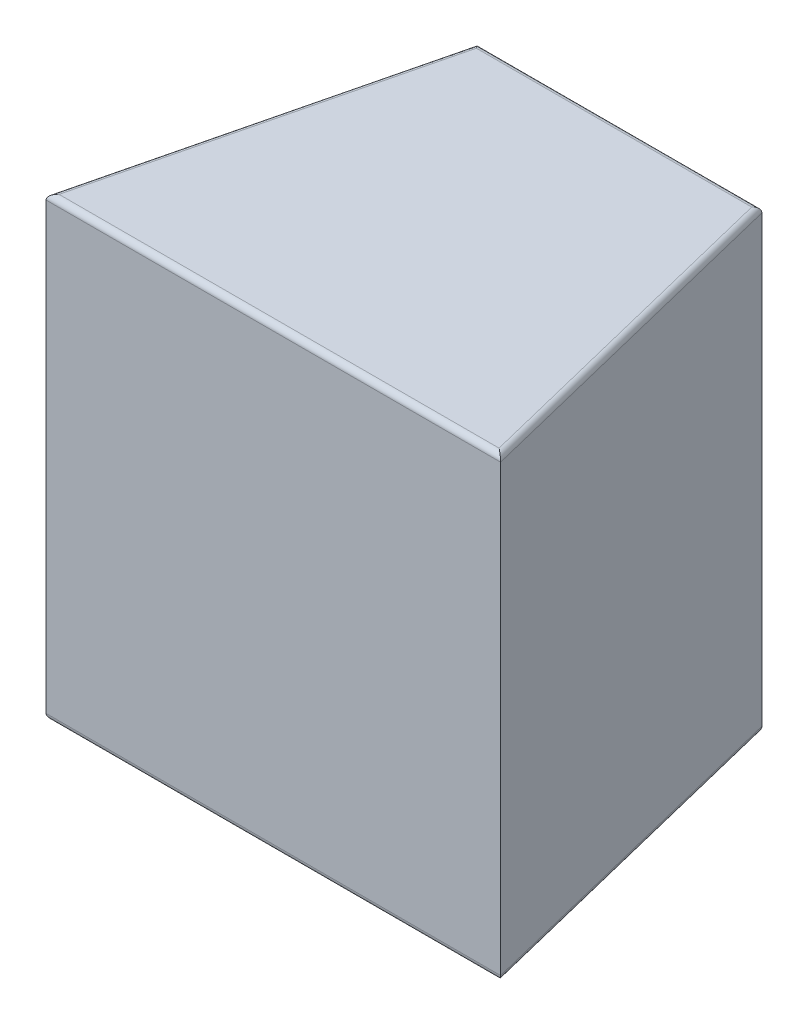
ISO-10303-21;
HEADER;
FILE_DESCRIPTION(('STEP AP214'),'2;1');
FILE_NAME('part.step','',(''),(''),'','','');
FILE_SCHEMA(('AUTOMOTIVE_DESIGN { 1 0 10303 214 1 1 1 1 }'));
ENDSEC;
DATA;
#1=APPLICATION_CONTEXT('core data for automotive mechanical design processes');
#2=APPLICATION_PROTOCOL_DEFINITION('international standard','automotive_design',2000,#1);
#3=PRODUCT_CONTEXT('',#1,'mechanical');
#4=PRODUCT('Part','Part','',(#3));
#5=PRODUCT_RELATED_PRODUCT_CATEGORY('part','',(#4));
#6=PRODUCT_DEFINITION_FORMATION('','',#4);
#7=PRODUCT_DEFINITION_CONTEXT('part definition',#1,'design');
#8=PRODUCT_DEFINITION('design','',#6,#7);
#9=PRODUCT_DEFINITION_SHAPE('','',#8);
#10=(LENGTH_UNIT() NAMED_UNIT(*) SI_UNIT(.MILLI.,.METRE.));
#11=(NAMED_UNIT(*) PLANE_ANGLE_UNIT() SI_UNIT($,.RADIAN.));
#12=(NAMED_UNIT(*) SI_UNIT($,.STERADIAN.) SOLID_ANGLE_UNIT());
#13=UNCERTAINTY_MEASURE_WITH_UNIT(LENGTH_MEASURE(1.E-05),#10,'distance_accuracy_value','');
#14=(GEOMETRIC_REPRESENTATION_CONTEXT(3) GLOBAL_UNCERTAINTY_ASSIGNED_CONTEXT((#13)) GLOBAL_UNIT_ASSIGNED_CONTEXT((#10,
#11,#12)) REPRESENTATION_CONTEXT('',''));
#15=CARTESIAN_POINT('',(0.,0.,0.));
#16=DIRECTION('',(0.,0.,1.));
#17=DIRECTION('',(1.,0.,0.));
#18=AXIS2_PLACEMENT_3D('',#15,#16,#17);
#19=CARTESIAN_POINT('',(12.4540593175391,40.,-15.1130124332802));
#20=DIRECTION('',(-0.971061095311276,0.,0.238831214820981));
#21=DIRECTION('',(0.238831214820981,0.,0.971061095311276));
#22=AXIS2_PLACEMENT_3D('',#19,#20,#21);
#23=PLANE('',#22);
#24=DIRECTION('',(0.,-1.,0.));
#25=VECTOR('',#24,1.);
#26=CARTESIAN_POINT('',(19.9298980943877,40.,15.2829146504495));
#27=LINE('',#26,#25);
#28=CARTESIAN_POINT('',(19.9298980943877,39.5,15.2829146504495));
#29=VERTEX_POINT('',#28);
#30=CARTESIAN_POINT('',(19.9298980943877,0.5,15.2829146504495));
#31=VERTEX_POINT('',#30);
#32=EDGE_CURVE('E163',#29,#31,#27,.T.);
#33=ORIENTED_EDGE('',*,*,#32,.T.);
#34=DIRECTION('',(-0.238831214820981,0.,-0.971061095311276));
#35=VECTOR('',#34,1.);
#36=CARTESIAN_POINT('',(12.4540593175391,0.5,-15.1130124332802));
#37=LINE('',#36,#35);
#38=CARTESIAN_POINT('',(12.4540593175391,0.5,-15.1130124332802));
#39=VERTEX_POINT('',#38);
#40=EDGE_CURVE('E130',#31,#39,#37,.T.);
#41=ORIENTED_EDGE('',*,*,#40,.T.);
#42=DIRECTION('',(0.,-1.,0.));
#43=VECTOR('',#42,1.);
#44=CARTESIAN_POINT('',(12.4540593175391,40.,-15.1130124332802));
#45=LINE('',#44,#43);
#46=CARTESIAN_POINT('',(12.4540593175391,39.5,-15.1130124332802));
#47=VERTEX_POINT('',#46);
#48=EDGE_CURVE('E114',#47,#39,#45,.T.);
#49=ORIENTED_EDGE('',*,*,#48,.F.);
#50=DIRECTION('',(-0.238831214820981,0.,-0.971061095311276));
#51=VECTOR('',#50,1.);
#52=CARTESIAN_POINT('',(12.4540593175391,39.5,-15.1130124332802));
#53=LINE('',#52,#51);
#54=EDGE_CURVE('E127',#47,#29,#53,.F.);
#55=ORIENTED_EDGE('',*,*,#54,.T.);
#56=EDGE_LOOP('',(#33,#41,#49,#55));
#57=FACE_BOUND('',#56,.T.);
#58=ADVANCED_FACE('F43',(#57),#23,.F.);
#59=CARTESIAN_POINT('',(-12.4773510107308,40.,-15.0994144570133));
#60=DIRECTION('',(0.000545415364206491,0.,0.999999851261029));
#61=DIRECTION('',(0.999999851261029,0.,-0.000545415364206491));
#62=AXIS2_PLACEMENT_3D('',#59,#60,#61);
#63=PLANE('',#62);
#64=ORIENTED_EDGE('',*,*,#48,.T.);
#65=DIRECTION('',(-0.999999851261029,0.,0.000545415364206491));
#66=VECTOR('',#65,1.);
#67=CARTESIAN_POINT('',(-12.4773510107308,0.5,-15.0994144570133));
#68=LINE('',#67,#66);
#69=CARTESIAN_POINT('',(-12.4773510107308,0.5,-15.0994144570133));
#70=VERTEX_POINT('',#69);
#71=EDGE_CURVE('E120',#39,#70,#68,.T.);
#72=ORIENTED_EDGE('',*,*,#71,.T.);
#73=DIRECTION('',(0.,-1.,0.));
#74=VECTOR('',#73,1.);
#75=CARTESIAN_POINT('',(-12.4773510107308,40.,-15.0994144570133));
#76=LINE('',#75,#74);
#77=CARTESIAN_POINT('',(-12.4773510107308,39.5,-15.0994144570133));
#78=VERTEX_POINT('',#77);
#79=EDGE_CURVE('E116',#78,#70,#76,.T.);
#80=ORIENTED_EDGE('',*,*,#79,.F.);
#81=DIRECTION('',(-0.999999851261029,0.,0.000545415364206491));
#82=VECTOR('',#81,1.);
#83=CARTESIAN_POINT('',(-12.4773510107308,39.5,-15.0994144570133));
#84=LINE('',#83,#82);
#85=EDGE_CURVE('E111',#78,#47,#84,.F.);
#86=ORIENTED_EDGE('',*,*,#85,.T.);
#87=EDGE_LOOP('',(#64,#72,#80,#86));
#88=FACE_BOUND('',#87,.T.);
#89=ADVANCED_FACE('F113',(#88),#63,.F.);
#90=CARTESIAN_POINT('',(-19.9200285334357,40.,15.3046494159276));
#91=DIRECTION('',(0.971321041962088,0.,0.237771809602576));
#92=DIRECTION('',(0.237771809602576,0.,-0.971321041962088));
#93=AXIS2_PLACEMENT_3D('',#90,#91,#92);
#94=PLANE('',#93);
#95=ORIENTED_EDGE('',*,*,#79,.T.);
#96=DIRECTION('',(-0.237771809602576,0.,0.971321041962088));
#97=VECTOR('',#96,1.);
#98=CARTESIAN_POINT('',(-19.9200285334357,0.5,15.3046494159276));
#99=LINE('',#98,#97);
#100=CARTESIAN_POINT('',(-19.9200285334357,0.5,15.3046494159276));
#101=VERTEX_POINT('',#100);
#102=EDGE_CURVE('E187',#70,#101,#99,.T.);
#103=ORIENTED_EDGE('',*,*,#102,.T.);
#104=DIRECTION('',(0.,-1.,0.));
#105=VECTOR('',#104,1.);
#106=CARTESIAN_POINT('',(-19.9200285334357,40.,15.3046494159276));
#107=LINE('',#106,#105);
#108=CARTESIAN_POINT('',(-19.9200285334357,39.5,15.3046494159276));
#109=VERTEX_POINT('',#108);
#110=EDGE_CURVE('E168',#109,#101,#107,.T.);
#111=ORIENTED_EDGE('',*,*,#110,.F.);
#112=DIRECTION('',(-0.237771809602576,0.,0.971321041962088));
#113=VECTOR('',#112,1.);
#114=CARTESIAN_POINT('',(-19.9200285334357,39.5,15.3046494159276));
#115=LINE('',#114,#113);
#116=EDGE_CURVE('E185',#109,#78,#115,.F.);
#117=ORIENTED_EDGE('',*,*,#116,.T.);
#118=EDGE_LOOP('',(#95,#103,#111,#117));
#119=FACE_BOUND('',#118,.T.);
#120=ADVANCED_FACE('F204',(#119),#94,.F.);
#121=CARTESIAN_POINT('',(19.9298980943877,40.,15.2829146504495));
#122=DIRECTION('',(-0.000545415364206613,0.,-0.999999851261029));
#123=DIRECTION('',(-0.999999851261029,0.,0.000545415364206613));
#124=AXIS2_PLACEMENT_3D('',#121,#122,#123);
#125=PLANE('',#124);
#126=ORIENTED_EDGE('',*,*,#110,.T.);
#127=DIRECTION('',(0.999999851261029,0.,-0.000545415364206613));
#128=VECTOR('',#127,1.);
#129=CARTESIAN_POINT('',(19.9298980943877,0.5,15.2829146504495));
#130=LINE('',#129,#128);
#131=EDGE_CURVE('E191',#101,#31,#130,.T.);
#132=ORIENTED_EDGE('',*,*,#131,.T.);
#133=ORIENTED_EDGE('',*,*,#32,.F.);
#134=DIRECTION('',(0.999999851261029,0.,-0.000545415364206613));
#135=VECTOR('',#134,1.);
#136=CARTESIAN_POINT('',(19.9298980943877,39.5,15.2829146504495));
#137=LINE('',#136,#135);
#138=EDGE_CURVE('E189',#29,#109,#137,.F.);
#139=ORIENTED_EDGE('',*,*,#138,.T.);
#140=EDGE_LOOP('',(#126,#132,#133,#139));
#141=FACE_BOUND('',#140,.T.);
#142=ADVANCED_FACE('F202',(#141),#125,.F.);
#143=CARTESIAN_POINT('',(0.,40.,0.));
#144=DIRECTION('',(0.,-1.,0.));
#145=DIRECTION('',(0.,0.,-1.));
#146=AXIS2_PLACEMENT_3D('',#143,#144,#145);
#147=PLANE('',#146);
#148=DIRECTION('',(0.999999851261029,0.,-0.000545415364206613));
#149=VECTOR('',#148,1.);
#150=CARTESIAN_POINT('',(0.00806875624291231,40.,14.7937802495003));
#151=LINE('',#150,#149);
#152=CARTESIAN_POINT('',(-19.2827844747067,40.,14.8043017788061));
#153=VERTEX_POINT('',#152);
#154=CARTESIAN_POINT('',(19.2921086202945,40.,14.7832624363101));
#155=VERTEX_POINT('',#154);
#156=EDGE_CURVE('E193',#153,#155,#151,.T.);
#157=ORIENTED_EDGE('',*,*,#156,.T.);
#158=DIRECTION('',(-0.238831214820981,0.,-0.971061095311276));
#159=VECTOR('',#158,1.);
#160=CARTESIAN_POINT('',(14.7631502034125,40.,-3.63097761272721));
#161=LINE('',#160,#159);
#162=CARTESIAN_POINT('',(12.0621855926844,40.,-14.6127986249285));
#163=VERTEX_POINT('',#162);
#164=EDGE_CURVE('E11',#155,#163,#161,.T.);
#165=ORIENTED_EDGE('',*,*,#164,.T.);
#166=DIRECTION('',(-0.999999851261029,0.,0.000545415364206491));
#167=VECTOR('',#166,1.);
#168=CARTESIAN_POINT('',(-0.00796645546476035,40.,-14.606215377574));
#169=LINE('',#168,#167);
#170=CARTESIAN_POINT('',(-12.0849318705119,40.,-14.5996284141039));
#171=VERTEX_POINT('',#170);
#172=EDGE_CURVE('E52',#163,#171,#169,.T.);
#173=ORIENTED_EDGE('',*,*,#172,.T.);
#174=DIRECTION('',(-0.237771809602576,0.,0.971321041962088));
#175=VECTOR('',#174,1.);
#176=CARTESIAN_POINT('',(-14.7735295133551,40.,-3.61644471277152));
#177=LINE('',#176,#175);
#178=EDGE_CURVE('E195',#171,#153,#177,.T.);
#179=ORIENTED_EDGE('',*,*,#178,.T.);
#180=EDGE_LOOP('',(#157,#165,#173,#179));
#181=FACE_BOUND('',#180,.T.);
#182=ADVANCED_FACE('F196',(#181),#147,.F.);
#183=CARTESIAN_POINT('',(0.,0.,0.));
#184=DIRECTION('',(0.,-1.,0.));
#185=DIRECTION('',(0.,0.,-1.));
#186=AXIS2_PLACEMENT_3D('',#183,#184,#185);
#187=PLANE('',#186);
#188=DIRECTION('',(-0.999999851261029,0.,0.000545415364206491));
#189=VECTOR('',#188,1.);
#190=CARTESIAN_POINT('',(12.4543320252212,0.,-14.6130125076497));
#191=LINE('',#190,#189);
#192=CARTESIAN_POINT('',(-12.0849318705119,0.,-14.5996284141039));
#193=VERTEX_POINT('',#192);
#194=CARTESIAN_POINT('',(12.0621855926844,0.,-14.6127986249285));
#195=VERTEX_POINT('',#194);
#196=EDGE_CURVE('E180',#193,#195,#191,.F.);
#197=ORIENTED_EDGE('',*,*,#196,.T.);
#198=DIRECTION('',(-0.238831214820981,0.,-0.971061095311276));
#199=VECTOR('',#198,1.);
#200=CARTESIAN_POINT('',(19.4443675467321,0.,15.40233025786));
#201=LINE('',#200,#199);
#202=CARTESIAN_POINT('',(19.2921086202945,0.,14.7832624363101));
#203=VERTEX_POINT('',#202);
#204=EDGE_CURVE('E121',#195,#203,#201,.F.);
#205=ORIENTED_EDGE('',*,*,#204,.T.);
#206=DIRECTION('',(0.999999851261029,0.,-0.000545415364206613));
#207=VECTOR('',#206,1.);
#208=CARTESIAN_POINT('',(-19.9203012411178,0.,14.8046494902971));
#209=LINE('',#208,#207);
#210=CARTESIAN_POINT('',(-19.2827844747067,0.,14.8043017788061));
#211=VERTEX_POINT('',#210);
#212=EDGE_CURVE('E176',#203,#211,#209,.F.);
#213=ORIENTED_EDGE('',*,*,#212,.T.);
#214=DIRECTION('',(-0.237771809602576,0.,0.971321041962088));
#215=VECTOR('',#214,1.);
#216=CARTESIAN_POINT('',(-11.9916904897498,0.,-14.980528552212));
#217=LINE('',#216,#215);
#218=EDGE_CURVE('E178',#211,#193,#217,.F.);
#219=ORIENTED_EDGE('',*,*,#218,.T.);
#220=EDGE_LOOP('',(#197,#205,#213,#219));
#221=FACE_BOUND('',#220,.T.);
#222=ADVANCED_FACE('F230',(#221),#187,.T.);
#223=CARTESIAN_POINT('',(-19.4343680124546,0.5,15.4235353207289));
#224=DIRECTION('',(0.237771809602576,0.,-0.971321041962088));
#225=DIRECTION('',(-0.971321041962088,0.,-0.237771809602576));
#226=AXIS2_PLACEMENT_3D('',#223,#224,#225);
#227=CYLINDRICAL_SURFACE('',#226,0.5);
#228=CARTESIAN_POINT('',(-12.0849318705119,0.5,-14.5996284141039));
#229=DIRECTION('',(0.786524634330285,0.,-0.617558903742477));
#230=DIRECTION('',(-0.617558903742477,0.,-0.786524634330286));
#231=AXIS2_PLACEMENT_3D('',#228,#229,#230);
#232=ELLIPSE('',#231,0.635435968683852,0.5);
#233=EDGE_CURVE('E155',#193,#70,#232,.T.);
#234=ORIENTED_EDGE('',*,*,#233,.F.);
#235=ORIENTED_EDGE('',*,*,#218,.F.);
#236=CARTESIAN_POINT('',(-19.2827844747067,0.5,14.8043017788061));
#237=DIRECTION('',(-0.617558903742477,0.,-0.786524634330286));
#238=DIRECTION('',(-0.786524634330285,0.,0.617558903742477));
#239=AXIS2_PLACEMENT_3D('',#236,#237,#238);
#240=ELLIPSE('',#239,0.810202288541885,0.5);
#241=EDGE_CURVE('E142',#101,#211,#240,.F.);
#242=ORIENTED_EDGE('',*,*,#241,.F.);
#243=ORIENTED_EDGE('',*,*,#102,.F.);
#244=EDGE_LOOP('',(#234,#235,#242,#243));
#245=FACE_BOUND('',#244,.T.);
#246=ADVANCED_FACE('F207',(#245),#227,.T.);
#247=CARTESIAN_POINT('',(19.9296253867056,0.5,14.782914724819));
#248=DIRECTION('',(-0.999999851261029,0.,0.000545415364206613));
#249=DIRECTION('',(0.000545415364206613,0.,0.999999851261029));
#250=AXIS2_PLACEMENT_3D('',#247,#248,#249);
#251=CYLINDRICAL_SURFACE('',#250,0.5);
#252=ORIENTED_EDGE('',*,*,#241,.T.);
#253=ORIENTED_EDGE('',*,*,#212,.F.);
#254=CARTESIAN_POINT('',(19.2921086202945,0.5,14.7832624363101));
#255=DIRECTION('',(-0.616700571210033,0.,0.787197818511471));
#256=DIRECTION('',(-0.787197818511471,0.,-0.616700571210033));
#257=AXIS2_PLACEMENT_3D('',#254,#255,#256);
#258=ELLIPSE('',#257,0.810202288541885,0.5);
#259=EDGE_CURVE('E149',#31,#203,#258,.F.);
#260=ORIENTED_EDGE('',*,*,#259,.F.);
#261=ORIENTED_EDGE('',*,*,#131,.F.);
#262=EDGE_LOOP('',(#252,#253,#260,#261));
#263=FACE_BOUND('',#262,.T.);
#264=ADVANCED_FACE('F209',(#263),#251,.T.);
#265=CARTESIAN_POINT('',(-12.4770783030487,0.5,-14.5994145313827));
#266=DIRECTION('',(0.999999851261029,0.,-0.000545415364206491));
#267=DIRECTION('',(-0.000545415364206491,0.,-0.999999851261029));
#268=AXIS2_PLACEMENT_3D('',#265,#266,#267);
#269=CYLINDRICAL_SURFACE('',#268,0.5);
#270=ORIENTED_EDGE('',*,*,#233,.T.);
#271=ORIENTED_EDGE('',*,*,#71,.F.);
#272=CARTESIAN_POINT('',(12.0621855926844,0.5,-14.6127986249285));
#273=DIRECTION('',(0.787197818511471,0.,0.616700571210033));
#274=DIRECTION('',(0.616700571210033,0.,-0.787197818511471));
#275=AXIS2_PLACEMENT_3D('',#272,#273,#274);
#276=ELLIPSE('',#275,0.635435968683852,0.5);
#277=EDGE_CURVE('E145',#195,#39,#276,.T.);
#278=ORIENTED_EDGE('',*,*,#277,.F.);
#279=ORIENTED_EDGE('',*,*,#196,.F.);
#280=EDGE_LOOP('',(#270,#271,#278,#279));
#281=FACE_BOUND('',#280,.T.);
#282=ADVANCED_FACE('F212',(#281),#269,.T.);
#283=CARTESIAN_POINT('',(11.9685287698835,0.5,-14.9935968258697));
#284=DIRECTION('',(0.238831214820981,0.,0.971061095311276));
#285=DIRECTION('',(0.971061095311276,0.,-0.238831214820981));
#286=AXIS2_PLACEMENT_3D('',#283,#284,#285);
#287=CYLINDRICAL_SURFACE('',#286,0.5);
#288=ORIENTED_EDGE('',*,*,#259,.T.);
#289=ORIENTED_EDGE('',*,*,#204,.F.);
#290=ORIENTED_EDGE('',*,*,#277,.T.);
#291=ORIENTED_EDGE('',*,*,#40,.F.);
#292=EDGE_LOOP('',(#288,#289,#290,#291));
#293=FACE_BOUND('',#292,.T.);
#294=ADVANCED_FACE('F210',(#293),#287,.T.);
#295=CARTESIAN_POINT('',(-14.7735295133551,39.5,-3.61644471277152));
#296=DIRECTION('',(-0.237771809602576,0.,0.971321041962088));
#297=DIRECTION('',(0.971321041962088,0.,0.237771809602576));
#298=AXIS2_PLACEMENT_3D('',#295,#296,#297);
#299=CYLINDRICAL_SURFACE('',#298,0.5);
#300=CARTESIAN_POINT('',(-12.0849318705119,39.5,-14.5996284141039));
#301=DIRECTION('',(-0.786524634330285,0.,0.617558903742477));
#302=DIRECTION('',(0.617558903742477,0.,0.786524634330286));
#303=AXIS2_PLACEMENT_3D('',#300,#301,#302);
#304=ELLIPSE('',#303,0.635435968683852,0.5);
#305=EDGE_CURVE('E139',#78,#171,#304,.F.);
#306=ORIENTED_EDGE('',*,*,#305,.F.);
#307=ORIENTED_EDGE('',*,*,#116,.F.);
#308=CARTESIAN_POINT('',(-19.2827844747067,39.5,14.8043017788061));
#309=DIRECTION('',(0.617558903742477,0.,0.786524634330286));
#310=DIRECTION('',(0.786524634330285,0.,-0.617558903742477));
#311=AXIS2_PLACEMENT_3D('',#308,#309,#310);
#312=ELLIPSE('',#311,0.810202288541885,0.5);
#313=EDGE_CURVE('E47',#153,#109,#312,.T.);
#314=ORIENTED_EDGE('',*,*,#313,.F.);
#315=ORIENTED_EDGE('',*,*,#178,.F.);
#316=EDGE_LOOP('',(#306,#307,#314,#315));
#317=FACE_BOUND('',#316,.T.);
#318=ADVANCED_FACE('F45',(#317),#299,.T.);
#319=CARTESIAN_POINT('',(0.00806875624291231,39.5,14.7937802495003));
#320=DIRECTION('',(0.999999851261029,0.,-0.000545415364206613));
#321=DIRECTION('',(-0.000545415364206613,0.,-0.999999851261029));
#322=AXIS2_PLACEMENT_3D('',#319,#320,#321);
#323=CYLINDRICAL_SURFACE('',#322,0.5);
#324=ORIENTED_EDGE('',*,*,#313,.T.);
#325=ORIENTED_EDGE('',*,*,#138,.F.);
#326=CARTESIAN_POINT('',(19.2921086202945,39.5,14.7832624363101));
#327=DIRECTION('',(0.616700571210033,0.,-0.787197818511471));
#328=DIRECTION('',(0.787197818511471,0.,0.616700571210033));
#329=AXIS2_PLACEMENT_3D('',#326,#327,#328);
#330=ELLIPSE('',#329,0.810202288541885,0.5);
#331=EDGE_CURVE('E134',#155,#29,#330,.T.);
#332=ORIENTED_EDGE('',*,*,#331,.F.);
#333=ORIENTED_EDGE('',*,*,#156,.F.);
#334=EDGE_LOOP('',(#324,#325,#332,#333));
#335=FACE_BOUND('',#334,.T.);
#336=ADVANCED_FACE('F199',(#335),#323,.T.);
#337=CARTESIAN_POINT('',(-0.00796645546476035,39.5,-14.606215377574));
#338=DIRECTION('',(-0.999999851261029,0.,0.000545415364206491));
#339=DIRECTION('',(0.000545415364206491,0.,0.999999851261029));
#340=AXIS2_PLACEMENT_3D('',#337,#338,#339);
#341=CYLINDRICAL_SURFACE('',#340,0.5);
#342=ORIENTED_EDGE('',*,*,#305,.T.);
#343=ORIENTED_EDGE('',*,*,#172,.F.);
#344=CARTESIAN_POINT('',(12.0621855926844,39.5,-14.6127986249285));
#345=DIRECTION('',(-0.787197818511471,0.,-0.616700571210033));
#346=DIRECTION('',(-0.616700571210033,0.,0.787197818511471));
#347=AXIS2_PLACEMENT_3D('',#344,#345,#346);
#348=ELLIPSE('',#347,0.635435968683852,0.5);
#349=EDGE_CURVE('E60',#47,#163,#348,.F.);
#350=ORIENTED_EDGE('',*,*,#349,.F.);
#351=ORIENTED_EDGE('',*,*,#85,.F.);
#352=EDGE_LOOP('',(#342,#343,#350,#351));
#353=FACE_BOUND('',#352,.T.);
#354=ADVANCED_FACE('F137',(#353),#341,.T.);
#355=CARTESIAN_POINT('',(14.7631502034125,39.5,-3.63097761272721));
#356=DIRECTION('',(-0.238831214820981,0.,-0.971061095311276));
#357=DIRECTION('',(-0.971061095311276,0.,0.238831214820981));
#358=AXIS2_PLACEMENT_3D('',#355,#356,#357);
#359=CYLINDRICAL_SURFACE('',#358,0.5);
#360=ORIENTED_EDGE('',*,*,#331,.T.);
#361=ORIENTED_EDGE('',*,*,#54,.F.);
#362=ORIENTED_EDGE('',*,*,#349,.T.);
#363=ORIENTED_EDGE('',*,*,#164,.F.);
#364=EDGE_LOOP('',(#360,#361,#362,#363));
#365=FACE_BOUND('',#364,.T.);
#366=ADVANCED_FACE('F132',(#365),#359,.T.);
#367=CLOSED_SHELL('',(#58,#89,#120,#142,#182,#222,#246,#264,#282,#294,#318,#336,#354,#366));
#368=MANIFOLD_SOLID_BREP('B2',#367);
#369=ADVANCED_BREP_SHAPE_REPRESENTATION('',(#18,#368),#14);
#370=SHAPE_DEFINITION_REPRESENTATION(#9,#369);
ENDSEC;
END-ISO-10303-21;
